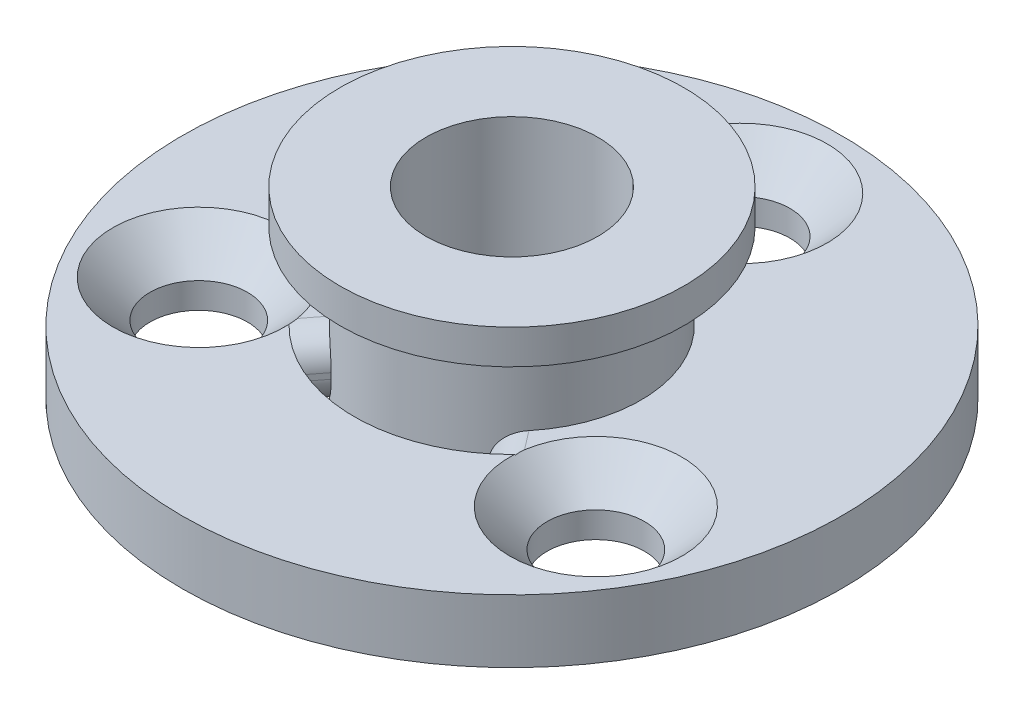
ISO-10303-21;
HEADER;
FILE_DESCRIPTION(('STEP AP214'),'2;1');
FILE_NAME('part.step','',(''),(''),'','','');
FILE_SCHEMA(('AUTOMOTIVE_DESIGN { 1 0 10303 214 1 1 1 1 }'));
ENDSEC;
DATA;
#1=APPLICATION_CONTEXT('core data for automotive mechanical design processes');
#2=APPLICATION_PROTOCOL_DEFINITION('international standard','automotive_design',2000,#1);
#3=PRODUCT_CONTEXT('',#1,'mechanical');
#4=PRODUCT('Part','Part','',(#3));
#5=PRODUCT_RELATED_PRODUCT_CATEGORY('part','',(#4));
#6=PRODUCT_DEFINITION_FORMATION('','',#4);
#7=PRODUCT_DEFINITION_CONTEXT('part definition',#1,'design');
#8=PRODUCT_DEFINITION('design','',#6,#7);
#9=PRODUCT_DEFINITION_SHAPE('','',#8);
#10=(LENGTH_UNIT() NAMED_UNIT(*) SI_UNIT(.MILLI.,.METRE.));
#11=(NAMED_UNIT(*) PLANE_ANGLE_UNIT() SI_UNIT($,.RADIAN.));
#12=(NAMED_UNIT(*) SI_UNIT($,.STERADIAN.) SOLID_ANGLE_UNIT());
#13=UNCERTAINTY_MEASURE_WITH_UNIT(LENGTH_MEASURE(1.E-05),#10,'distance_accuracy_value','');
#14=(GEOMETRIC_REPRESENTATION_CONTEXT(3) GLOBAL_UNCERTAINTY_ASSIGNED_CONTEXT((#13)) GLOBAL_UNIT_ASSIGNED_CONTEXT((#10,
#11,#12)) REPRESENTATION_CONTEXT('',''));
#15=CARTESIAN_POINT('',(0.,0.,0.));
#16=DIRECTION('',(0.,0.,1.));
#17=DIRECTION('',(1.,0.,0.));
#18=AXIS2_PLACEMENT_3D('',#15,#16,#17);
#19=CARTESIAN_POINT('',(11.5,-3.2,0.));
#20=DIRECTION('',(0.,1.,0.));
#21=DIRECTION('',(0.,0.,1.));
#22=AXIS2_PLACEMENT_3D('',#19,#20,#21);
#23=PLANE('',#22);
#24=DIRECTION('',(-0.608761429008723,0.,-0.793353340291233));
#25=VECTOR('',#24,1.);
#26=CARTESIAN_POINT('',(5.05514383095177,-3.2,4.94531207215343));
#27=LINE('',#26,#25);
#28=CARTESIAN_POINT('',(4.08573416051475,-3.2,3.68195279296229));
#29=VERTEX_POINT('',#28);
#30=CARTESIAN_POINT('',(3.46428327027597,-3.2,2.87206222482836));
#31=VERTEX_POINT('',#30);
#32=EDGE_CURVE('E130',#29,#31,#27,.T.);
#33=ORIENTED_EDGE('',*,*,#32,.T.);
#34=CARTESIAN_POINT('',(0.,-3.2,0.));
#35=DIRECTION('',(0.,-1.,0.));
#36=DIRECTION('',(0.,0.,-1.));
#37=AXIS2_PLACEMENT_3D('',#34,#35,#36);
#38=CIRCLE('',#37,4.5);
#39=CARTESIAN_POINT('',(-3.46428327027597,-3.2,2.87206222482836));
#40=VERTEX_POINT('',#39);
#41=EDGE_CURVE('E124',#31,#40,#38,.T.);
#42=ORIENTED_EDGE('',*,*,#41,.T.);
#43=DIRECTION('',(-0.608761429008722,0.,0.793353340291234));
#44=VECTOR('',#43,1.);
#45=CARTESIAN_POINT('',(3.46843715036929,-3.2,-6.16283493017087));
#46=LINE('',#45,#44);
#47=CARTESIAN_POINT('',(-4.08573416051475,-3.2,3.68195279296229));
#48=VERTEX_POINT('',#47);
#49=EDGE_CURVE('E128',#40,#48,#46,.T.);
#50=ORIENTED_EDGE('',*,*,#49,.T.);
#51=CARTESIAN_POINT('',(0.,-3.2,0.));
#52=DIRECTION('',(0.,1.,0.));
#53=DIRECTION('',(0.,0.,1.));
#54=AXIS2_PLACEMENT_3D('',#51,#52,#53);
#55=CIRCLE('',#54,5.5);
#56=EDGE_CURVE('E133',#48,#29,#55,.T.);
#57=ORIENTED_EDGE('',*,*,#56,.T.);
#58=EDGE_LOOP('',(#33,#42,#50,#57));
#59=FACE_BOUND('',#58,.T.);
#60=CARTESIAN_POINT('',(-6.92820323027555,-3.2,3.99999999999994));
#61=DIRECTION('',(0.,1.,0.));
#62=DIRECTION('',(0.,0.,1.));
#63=AXIS2_PLACEMENT_3D('',#60,#61,#62);
#64=CIRCLE('',#63,1.7);
#65=CARTESIAN_POINT('',(-6.92820323027555,-3.2,5.69999999999994));
#66=VERTEX_POINT('',#65);
#67=EDGE_CURVE('E335',#66,#66,#64,.T.);
#68=ORIENTED_EDGE('',*,*,#67,.T.);
#69=EDGE_LOOP('',(#68));
#70=FACE_BOUND('',#69,.T.);
#71=CARTESIAN_POINT('',(6.92820323027549,-3.2,4.00000000000003));
#72=DIRECTION('',(0.,1.,0.));
#73=DIRECTION('',(0.,0.,1.));
#74=AXIS2_PLACEMENT_3D('',#71,#72,#73);
#75=CIRCLE('',#74,1.7);
#76=CARTESIAN_POINT('',(6.92820323027549,-3.2,5.70000000000003));
#77=VERTEX_POINT('',#76);
#78=EDGE_CURVE('E326',#77,#77,#75,.T.);
#79=ORIENTED_EDGE('',*,*,#78,.T.);
#80=EDGE_LOOP('',(#79));
#81=FACE_BOUND('',#80,.T.);
#82=CARTESIAN_POINT('',(0.,-3.2,-8.));
#83=DIRECTION('',(0.,1.,0.));
#84=DIRECTION('',(0.,0.,1.));
#85=AXIS2_PLACEMENT_3D('',#82,#83,#84);
#86=CIRCLE('',#85,1.7);
#87=CARTESIAN_POINT('',(0.,-3.2,-6.3));
#88=VERTEX_POINT('',#87);
#89=EDGE_CURVE('E317',#88,#88,#86,.T.);
#90=ORIENTED_EDGE('',*,*,#89,.T.);
#91=EDGE_LOOP('',(#90));
#92=FACE_BOUND('',#91,.T.);
#93=CARTESIAN_POINT('',(0.,-3.2,0.));
#94=DIRECTION('',(0.,1.,0.));
#95=DIRECTION('',(0.,0.,1.));
#96=AXIS2_PLACEMENT_3D('',#93,#94,#95);
#97=CIRCLE('',#96,11.5);
#98=CARTESIAN_POINT('',(0.,-3.2,11.5));
#99=VERTEX_POINT('',#98);
#100=EDGE_CURVE('E314',#99,#99,#97,.T.);
#101=ORIENTED_EDGE('',*,*,#100,.F.);
#102=EDGE_LOOP('',(#101));
#103=FACE_BOUND('',#102,.T.);
#104=CARTESIAN_POINT('',(0.,-3.2,0.));
#105=DIRECTION('',(0.,1.,0.));
#106=DIRECTION('',(0.,0.,1.));
#107=AXIS2_PLACEMENT_3D('',#104,#105,#106);
#108=CIRCLE('',#107,3.);
#109=CARTESIAN_POINT('',(0.,-3.2,3.));
#110=VERTEX_POINT('',#109);
#111=EDGE_CURVE('E149',#110,#110,#108,.T.);
#112=ORIENTED_EDGE('',*,*,#111,.T.);
#113=EDGE_LOOP('',(#112));
#114=FACE_BOUND('',#113,.T.);
#115=ADVANCED_FACE('F41',(#59,#70,#81,#92,#103,#114),#23,.F.);
#116=CARTESIAN_POINT('',(0.,4.68987341772152,0.));
#117=DIRECTION('',(0.,1.,0.));
#118=DIRECTION('',(0.,0.,1.));
#119=AXIS2_PLACEMENT_3D('',#116,#117,#118);
#120=CYLINDRICAL_SURFACE('',#119,3.);
#121=ORIENTED_EDGE('',*,*,#111,.F.);
#122=EDGE_LOOP('',(#121));
#123=FACE_BOUND('',#122,.T.);
#124=CARTESIAN_POINT('',(0.,3.2,0.));
#125=DIRECTION('',(0.,1.,0.));
#126=DIRECTION('',(0.,0.,1.));
#127=AXIS2_PLACEMENT_3D('',#124,#125,#126);
#128=CIRCLE('',#127,3.);
#129=CARTESIAN_POINT('',(0.,3.2,3.));
#130=VERTEX_POINT('',#129);
#131=EDGE_CURVE('E154',#130,#130,#128,.T.);
#132=ORIENTED_EDGE('',*,*,#131,.T.);
#133=EDGE_LOOP('',(#132));
#134=FACE_BOUND('',#133,.T.);
#135=ADVANCED_FACE('F269',(#123,#134),#120,.F.);
#136=CARTESIAN_POINT('',(3.,3.2,0.));
#137=DIRECTION('',(0.,-1.,0.));
#138=DIRECTION('',(0.,0.,-1.));
#139=AXIS2_PLACEMENT_3D('',#136,#137,#138);
#140=PLANE('',#139);
#141=ORIENTED_EDGE('',*,*,#131,.F.);
#142=EDGE_LOOP('',(#141));
#143=FACE_BOUND('',#142,.T.);
#144=CARTESIAN_POINT('',(0.,3.2,0.));
#145=DIRECTION('',(0.,1.,0.));
#146=DIRECTION('',(0.,0.,1.));
#147=AXIS2_PLACEMENT_3D('',#144,#145,#146);
#148=CIRCLE('',#147,6.);
#149=CARTESIAN_POINT('',(0.,3.2,6.));
#150=VERTEX_POINT('',#149);
#151=EDGE_CURVE('E298',#150,#150,#148,.T.);
#152=ORIENTED_EDGE('',*,*,#151,.T.);
#153=EDGE_LOOP('',(#152));
#154=FACE_BOUND('',#153,.T.);
#155=ADVANCED_FACE('F272',(#143,#154),#140,.F.);
#156=CARTESIAN_POINT('',(0.,4.68987341772152,0.));
#157=DIRECTION('',(0.,1.,0.));
#158=DIRECTION('',(0.,0.,1.));
#159=AXIS2_PLACEMENT_3D('',#156,#157,#158);
#160=CYLINDRICAL_SURFACE('',#159,6.);
#161=ORIENTED_EDGE('',*,*,#151,.F.);
#162=EDGE_LOOP('',(#161));
#163=FACE_BOUND('',#162,.T.);
#164=CARTESIAN_POINT('',(0.,2.,0.));
#165=DIRECTION('',(0.,1.,0.));
#166=DIRECTION('',(0.,0.,1.));
#167=AXIS2_PLACEMENT_3D('',#164,#165,#166);
#168=CIRCLE('',#167,6.);
#169=CARTESIAN_POINT('',(0.,2.,6.));
#170=VERTEX_POINT('',#169);
#171=EDGE_CURVE('E292',#170,#170,#168,.T.);
#172=ORIENTED_EDGE('',*,*,#171,.T.);
#173=EDGE_LOOP('',(#172));
#174=FACE_BOUND('',#173,.T.);
#175=ADVANCED_FACE('F276',(#163,#174),#160,.T.);
#176=CARTESIAN_POINT('',(6.,2.,0.));
#177=DIRECTION('',(0.,1.,0.));
#178=DIRECTION('',(0.,0.,1.));
#179=AXIS2_PLACEMENT_3D('',#176,#177,#178);
#180=PLANE('',#179);
#181=ORIENTED_EDGE('',*,*,#171,.F.);
#182=EDGE_LOOP('',(#181));
#183=FACE_BOUND('',#182,.T.);
#184=CARTESIAN_POINT('',(0.,2.,0.));
#185=DIRECTION('',(0.,1.,0.));
#186=DIRECTION('',(0.,0.,1.));
#187=AXIS2_PLACEMENT_3D('',#184,#185,#186);
#188=CIRCLE('',#187,4.5);
#189=CARTESIAN_POINT('',(0.,2.,4.5));
#190=VERTEX_POINT('',#189);
#191=EDGE_CURVE('E295',#190,#190,#188,.T.);
#192=ORIENTED_EDGE('',*,*,#191,.T.);
#193=EDGE_LOOP('',(#192));
#194=FACE_BOUND('',#193,.T.);
#195=ADVANCED_FACE('F279',(#183,#194),#180,.F.);
#196=CARTESIAN_POINT('',(0.,4.68987341772152,0.));
#197=DIRECTION('',(0.,1.,0.));
#198=DIRECTION('',(0.,0.,1.));
#199=AXIS2_PLACEMENT_3D('',#196,#197,#198);
#200=CYLINDRICAL_SURFACE('',#199,4.5);
#201=ORIENTED_EDGE('',*,*,#191,.F.);
#202=EDGE_LOOP('',(#201));
#203=FACE_BOUND('',#202,.T.);
#204=DIRECTION('',(0.,1.,0.));
#205=VECTOR('',#204,1.);
#206=CARTESIAN_POINT('',(2.73942643053925,-3.2,3.57009003131055));
#207=LINE('',#206,#205);
#208=CARTESIAN_POINT('',(2.73942643053925,-2.2,3.57009003131055));
#209=VERTEX_POINT('',#208);
#210=CARTESIAN_POINT('',(2.73942643053925,-2.,3.57009003131055));
#211=VERTEX_POINT('',#210);
#212=EDGE_CURVE('E344',#209,#211,#207,.T.);
#213=ORIENTED_EDGE('',*,*,#212,.T.);
#214=CARTESIAN_POINT('',(2.73942643053925,-2.,3.57009003131055));
#215=CARTESIAN_POINT('',(2.73942565688171,-1.97187899760377,3.57008871283491));
#216=CARTESIAN_POINT('',(2.74036818941399,-1.94377146341499,3.56936760936641));
#217=CARTESIAN_POINT('',(2.74412233525025,-1.88775727596897,3.5664829836844));
#218=CARTESIAN_POINT('',(2.74693386278592,-1.85985061355311,3.56431952766053));
#219=CARTESIAN_POINT('',(2.75813408967678,-1.77677561027794,3.5556702819096));
#220=CARTESIAN_POINT('',(2.76928854928323,-1.72216326337328,3.54702562133556));
#221=CARTESIAN_POINT('',(2.79850826333545,-1.61608219502955,3.5240166391249));
#222=CARTESIAN_POINT('',(2.81657702190278,-1.5646150829377,3.5096494171804));
#223=CARTESIAN_POINT('',(2.85886409197046,-1.46629203883097,3.47528924854408));
#224=CARTESIAN_POINT('',(2.88308136316857,-1.41943532861472,3.45529725347816));
#225=CARTESIAN_POINT('',(2.93660586520829,-1.33176854362263,3.40992237773051));
#226=CARTESIAN_POINT('',(2.9659024654471,-1.2909461636677,3.38455073195109));
#227=CARTESIAN_POINT('',(3.02842641542243,-1.21640101617028,3.32872129203923));
#228=CARTESIAN_POINT('',(3.06165372700131,-1.18267817971731,3.29826354727928));
#229=CARTESIAN_POINT('',(3.13041466986281,-1.12353436985234,3.23306780000334));
#230=CARTESIAN_POINT('',(3.16592652704929,-1.09804588777396,3.19836799524316));
#231=CARTESIAN_POINT('',(3.23816827731865,-1.0556362673716,3.12520455131174));
#232=CARTESIAN_POINT('',(3.27489786586538,-1.0387130039815,3.08674184855976));
#233=CARTESIAN_POINT('',(3.33734606601656,-1.01747424844011,3.01886932886236));
#234=CARTESIAN_POINT('',(3.3630933518554,-1.01090662968128,2.99016573835663));
#235=CARTESIAN_POINT('',(3.41412007456745,-1.00216907636313,2.93177466333198));
#236=CARTESIAN_POINT('',(3.4394001995666,-0.999992060034545,2.90208884184056));
#237=CARTESIAN_POINT('',(3.46428327027597,-1.,2.87206222482836));
#238=B_SPLINE_CURVE_WITH_KNOTS('',3,(#214,#215,#216,#217,#218,#219,#220,#221,#222,#223,#224,
#225,#226,#227,#228,#229,#230,#231,#232,#233,#234,#235,#236,#237),.UNSPECIFIED.,.F.,.F.,(4,2,2,
2,2,2,2,2,2,2,2,4),(0.,0.0843112207709436,0.168618572761153,0.336969701442703,0.505406262614099,
0.67381434400424,0.841874125095973,1.00993227486941,1.17657542266951,1.34317720532399,
1.46027197682244,1.57717773018718),.UNSPECIFIED.);
#239=CARTESIAN_POINT('',(3.46428327027597,-1.,2.87206222482836));
#240=VERTEX_POINT('',#239);
#241=EDGE_CURVE('E55',#211,#240,#238,.T.);
#242=ORIENTED_EDGE('',*,*,#241,.T.);
#243=CARTESIAN_POINT('',(0.,-1.,0.));
#244=DIRECTION('',(0.,1.,0.));
#245=DIRECTION('',(0.,0.,1.));
#246=AXIS2_PLACEMENT_3D('',#243,#244,#245);
#247=CIRCLE('',#246,4.5);
#248=CARTESIAN_POINT('',(-3.46428327027597,-1.,2.87206222482836));
#249=VERTEX_POINT('',#248);
#250=EDGE_CURVE('E296',#240,#249,#247,.T.);
#251=ORIENTED_EDGE('',*,*,#250,.T.);
#252=CARTESIAN_POINT('',(-3.46428327027597,-1.,2.87206222482836));
#253=CARTESIAN_POINT('',(-3.44636968878849,-1.00000017399588,2.89367168476496));
#254=CARTESIAN_POINT('',(-3.42825891884711,-1.00112427543845,2.91510280001001));
#255=CARTESIAN_POINT('',(-3.39176055755314,-1.0056375964909,2.957488990778));
#256=CARTESIAN_POINT('',(-3.37337293644022,-1.00902706134166,2.97844401450683));
#257=CARTESIAN_POINT('',(-3.31802561133945,-1.02260712910446,3.04035460548356));
#258=CARTESIAN_POINT('',(-3.2808337210137,-1.03620932342427,3.08041314242673));
#259=CARTESIAN_POINT('',(-3.20714190665605,-1.07232170191356,3.15706810237797));
#260=CARTESIAN_POINT('',(-3.17064290481398,-1.0948429898635,3.19366013914767));
#261=CARTESIAN_POINT('',(-3.09975162123149,-1.14823595223073,3.26251152187056));
#262=CARTESIAN_POINT('',(-3.0653584384749,-1.17910402425493,3.29477272800139));
#263=CARTESIAN_POINT('',(-3.00044721273947,-1.24789626889389,3.35398670438884));
#264=CARTESIAN_POINT('',(-2.96988545782309,-1.28572573291121,3.3810017555841));
#265=CARTESIAN_POINT('',(-2.91333245926661,-1.36764844571653,3.42985332602239));
#266=CARTESIAN_POINT('',(-2.88734254710892,-1.41174351253291,3.45168833729783));
#267=CARTESIAN_POINT('',(-2.84086507050541,-1.50520101693256,3.49004325894955));
#268=CARTESIAN_POINT('',(-2.82040794046862,-1.55459058256651,3.50653386575627));
#269=CARTESIAN_POINT('',(-2.78602900318347,-1.65704784234158,3.53391106299234));
#270=CARTESIAN_POINT('',(-2.77210415590609,-1.7101138123148,3.54480026046408));
#271=CARTESIAN_POINT('',(-2.7543443677954,-1.80282992091665,3.55860594428166));
#272=CARTESIAN_POINT('',(-2.7487598387046,-1.84195320632167,3.56291429137886));
#273=CARTESIAN_POINT('',(-2.74129778874026,-1.92071258105357,3.56865406960451));
#274=CARTESIAN_POINT('',(-2.7394158389709,-1.96034800056224,3.57008893792455));
#275=CARTESIAN_POINT('',(-2.73942643053925,-2.,3.57009003131055));
#276=B_SPLINE_CURVE_WITH_KNOTS('',3,(#252,#253,#254,#255,#256,#257,#258,#259,#260,#261,#262,
#263,#264,#265,#266,#267,#268,#269,#270,#271,#272,#273,#274,#275),.UNSPECIFIED.,.F.,.F.,(4,2,2,
2,2,2,2,2,2,2,2,4),(0.,0.0841591112206655,0.168327334709592,0.336442524073814,0.504767668859961,
0.673020281739215,0.839133566949739,1.00529515041985,1.17235296817529,1.33933296234293,
1.45832896752482,1.5771825470993),.UNSPECIFIED.);
#277=CARTESIAN_POINT('',(-2.73942643053925,-2.,3.57009003131055));
#278=VERTEX_POINT('',#277);
#279=EDGE_CURVE('E203',#249,#278,#276,.T.);
#280=ORIENTED_EDGE('',*,*,#279,.T.);
#281=DIRECTION('',(0.,1.,0.));
#282=VECTOR('',#281,1.);
#283=CARTESIAN_POINT('',(-2.73942643053925,-3.2,3.57009003131055));
#284=LINE('',#283,#282);
#285=CARTESIAN_POINT('',(-2.73942643053925,-2.2,3.57009003131055));
#286=VERTEX_POINT('',#285);
#287=EDGE_CURVE('E141',#286,#278,#284,.T.);
#288=ORIENTED_EDGE('',*,*,#287,.F.);
#289=CARTESIAN_POINT('',(-2.73942643053925,-2.2,3.57009003131055));
#290=CARTESIAN_POINT('',(-2.73942565688171,-2.22812100239623,3.57008871283491));
#291=CARTESIAN_POINT('',(-2.74036818941399,-2.25622853658501,3.56936760936641));
#292=CARTESIAN_POINT('',(-2.74412233525025,-2.31224272403103,3.5664829836844));
#293=CARTESIAN_POINT('',(-2.74693386278592,-2.34014938644689,3.56431952766053));
#294=CARTESIAN_POINT('',(-2.75813408967678,-2.42322438972206,3.55567028190961));
#295=CARTESIAN_POINT('',(-2.76928854928323,-2.47783673662672,3.54702562133556));
#296=CARTESIAN_POINT('',(-2.79850826333545,-2.58391780497045,3.5240166391249));
#297=CARTESIAN_POINT('',(-2.81657702190278,-2.6353849170623,3.5096494171804));
#298=CARTESIAN_POINT('',(-2.85886409197046,-2.73370796116903,3.47528924854408));
#299=CARTESIAN_POINT('',(-2.88308136316857,-2.78056467138528,3.45529725347816));
#300=CARTESIAN_POINT('',(-2.93660586520829,-2.86823145637737,3.40992237773051));
#301=CARTESIAN_POINT('',(-2.96590246544709,-2.9090538363323,3.38455073195109));
#302=CARTESIAN_POINT('',(-3.02842641542243,-2.98359898382972,3.32872129203923));
#303=CARTESIAN_POINT('',(-3.06165372700131,-3.01732182028269,3.29826354727928));
#304=CARTESIAN_POINT('',(-3.13041466986281,-3.07646563014766,3.23306780000334));
#305=CARTESIAN_POINT('',(-3.16592652704929,-3.10195411222604,3.19836799524316));
#306=CARTESIAN_POINT('',(-3.23816827731865,-3.1443637326284,3.12520455131174));
#307=CARTESIAN_POINT('',(-3.27489786586537,-3.1612869960185,3.08674184855976));
#308=CARTESIAN_POINT('',(-3.33734606601656,-3.18252575155989,3.01886932886236));
#309=CARTESIAN_POINT('',(-3.36309335185539,-3.18909337031872,2.99016573835663));
#310=CARTESIAN_POINT('',(-3.41412007456745,-3.19783092363687,2.93177466333199));
#311=CARTESIAN_POINT('',(-3.4394001995666,-3.20000793996546,2.90208884184057));
#312=CARTESIAN_POINT('',(-3.46428327027597,-3.2,2.87206222482836));
#313=B_SPLINE_CURVE_WITH_KNOTS('',3,(#289,#290,#291,#292,#293,#294,#295,#296,#297,#298,#299,
#300,#301,#302,#303,#304,#305,#306,#307,#308,#309,#310,#311,#312),.UNSPECIFIED.,.F.,.F.,(4,2,2,
2,2,2,2,2,2,2,2,4),(0.,0.0843112207709435,0.168618572761153,0.336969701442703,0.505406262614099,
0.673814344004239,0.841874125095972,1.00993227486941,1.17657542266951,1.34317720532399,
1.46027197682244,1.57717773018718),.UNSPECIFIED.);
#314=EDGE_CURVE('E137',#286,#40,#313,.T.);
#315=ORIENTED_EDGE('',*,*,#314,.T.);
#316=ORIENTED_EDGE('',*,*,#41,.F.);
#317=CARTESIAN_POINT('',(3.46428327027597,-3.2,2.87206222482836));
#318=CARTESIAN_POINT('',(3.4463696887885,-3.19999982600412,2.89367168476496));
#319=CARTESIAN_POINT('',(3.42825891884712,-3.19887572456155,2.91510280001001));
#320=CARTESIAN_POINT('',(3.39176055755314,-3.1943624035091,2.957488990778));
#321=CARTESIAN_POINT('',(3.37337293644022,-3.19097293865834,2.97844401450682));
#322=CARTESIAN_POINT('',(3.31802561133945,-3.17739287089554,3.04035460548355));
#323=CARTESIAN_POINT('',(3.2808337210137,-3.16379067657573,3.08041314242673));
#324=CARTESIAN_POINT('',(3.20714190665606,-3.12767829808644,3.15706810237797));
#325=CARTESIAN_POINT('',(3.17064290481398,-3.1051570101365,3.19366013914767));
#326=CARTESIAN_POINT('',(3.09975162123149,-3.05176404776927,3.26251152187056));
#327=CARTESIAN_POINT('',(3.0653584384749,-3.02089597574507,3.29477272800138));
#328=CARTESIAN_POINT('',(3.00044721273947,-2.95210373110611,3.35398670438884));
#329=CARTESIAN_POINT('',(2.9698854578231,-2.91427426708879,3.38100175558409));
#330=CARTESIAN_POINT('',(2.91333245926661,-2.83235155428347,3.42985332602238));
#331=CARTESIAN_POINT('',(2.88734254710892,-2.78825648746709,3.45168833729782));
#332=CARTESIAN_POINT('',(2.84086507050542,-2.69479898306744,3.49004325894955));
#333=CARTESIAN_POINT('',(2.82040794046862,-2.64540941743349,3.50653386575627));
#334=CARTESIAN_POINT('',(2.78602900318347,-2.54295215765843,3.53391106299234));
#335=CARTESIAN_POINT('',(2.77210415590609,-2.4898861876852,3.54480026046408));
#336=CARTESIAN_POINT('',(2.7543443677954,-2.39717007908335,3.55860594428166));
#337=CARTESIAN_POINT('',(2.7487598387046,-2.35804679367834,3.56291429137885));
#338=CARTESIAN_POINT('',(2.74129778874026,-2.27928741894643,3.56865406960451));
#339=CARTESIAN_POINT('',(2.7394158389709,-2.23965199943776,3.57008893792455));
#340=CARTESIAN_POINT('',(2.73942643053925,-2.2,3.57009003131055));
#341=B_SPLINE_CURVE_WITH_KNOTS('',3,(#317,#318,#319,#320,#321,#322,#323,#324,#325,#326,#327,
#328,#329,#330,#331,#332,#333,#334,#335,#336,#337,#338,#339,#340),.UNSPECIFIED.,.F.,.F.,(4,2,2,
2,2,2,2,2,2,2,2,4),(0.,0.0841591112206649,0.168327334709591,0.336442524073814,0.50476766885996,
0.673020281739215,0.839133566949739,1.00529515041985,1.17235296817528,1.33933296234293,
1.45832896752482,1.5771825470993),.UNSPECIFIED.);
#342=EDGE_CURVE('E245',#31,#209,#341,.T.);
#343=ORIENTED_EDGE('',*,*,#342,.T.);
#344=EDGE_LOOP('',(#213,#242,#251,#280,#288,#315,#316,#343));
#345=FACE_BOUND('',#344,.T.);
#346=ADVANCED_FACE('F139',(#203,#345),#200,.T.);
#347=CARTESIAN_POINT('',(4.5,-1.,0.));
#348=DIRECTION('',(0.,-1.,0.));
#349=DIRECTION('',(0.,0.,-1.));
#350=AXIS2_PLACEMENT_3D('',#347,#348,#349);
#351=PLANE('',#350);
#352=CARTESIAN_POINT('',(0.,-1.,0.));
#353=DIRECTION('',(0.,1.,0.));
#354=DIRECTION('',(0.,0.,1.));
#355=AXIS2_PLACEMENT_3D('',#352,#353,#354);
#356=CIRCLE('',#355,5.5);
#357=CARTESIAN_POINT('',(-3.93218384465516,-1.,3.84550779635577));
#358=VERTEX_POINT('',#357);
#359=CARTESIAN_POINT('',(3.93218384465511,-1.,3.84550779635582));
#360=VERTEX_POINT('',#359);
#361=EDGE_CURVE('E62',#358,#360,#356,.T.);
#362=ORIENTED_EDGE('',*,*,#361,.F.);
#363=CARTESIAN_POINT('',(-6.92820323027555,-1.,3.99999999999994));
#364=DIRECTION('',(0.,1.,0.));
#365=DIRECTION('',(0.,0.,1.));
#366=AXIS2_PLACEMENT_3D('',#363,#364,#365);
#367=CIRCLE('',#366,3.);
#368=CARTESIAN_POINT('',(-3.96591721349357,-1.,3.52580430750792));
#369=VERTEX_POINT('',#368);
#370=EDGE_CURVE('E341',#369,#358,#367,.T.);
#371=ORIENTED_EDGE('',*,*,#370,.F.);
#372=DIRECTION('',(-0.608761429008722,0.,0.793353340291234));
#373=VECTOR('',#372,1.);
#374=CARTESIAN_POINT('',(0.874303808228103,-1.,-2.78209453815913));
#375=LINE('',#374,#373);
#376=EDGE_CURVE('E169',#369,#249,#375,.F.);
#377=ORIENTED_EDGE('',*,*,#376,.T.);
#378=ORIENTED_EDGE('',*,*,#250,.F.);
#379=DIRECTION('',(-0.608761429008723,0.,-0.793353340291233));
#380=VECTOR('',#379,1.);
#381=CARTESIAN_POINT('',(2.46101048881057,-1.,1.56457168014169));
#382=LINE('',#381,#380);
#383=CARTESIAN_POINT('',(3.96591721349354,-1.,3.52580430750787));
#384=VERTEX_POINT('',#383);
#385=EDGE_CURVE('E167',#240,#384,#382,.F.);
#386=ORIENTED_EDGE('',*,*,#385,.T.);
#387=CARTESIAN_POINT('',(6.92820323027549,-1.,4.00000000000003));
#388=DIRECTION('',(0.,1.,0.));
#389=DIRECTION('',(0.,0.,1.));
#390=AXIS2_PLACEMENT_3D('',#387,#388,#389);
#391=CIRCLE('',#390,3.);
#392=EDGE_CURVE('E332',#360,#384,#391,.T.);
#393=ORIENTED_EDGE('',*,*,#392,.F.);
#394=EDGE_LOOP('',(#362,#371,#377,#378,#386,#393));
#395=FACE_BOUND('',#394,.T.);
#396=CARTESIAN_POINT('',(0.,-1.,-8.));
#397=DIRECTION('',(0.,1.,0.));
#398=DIRECTION('',(0.,0.,1.));
#399=AXIS2_PLACEMENT_3D('',#396,#397,#398);
#400=CIRCLE('',#399,3.);
#401=CARTESIAN_POINT('',(0.,-1.,-5.));
#402=VERTEX_POINT('',#401);
#403=EDGE_CURVE('E323',#402,#402,#400,.T.);
#404=ORIENTED_EDGE('',*,*,#403,.F.);
#405=EDGE_LOOP('',(#404));
#406=FACE_BOUND('',#405,.T.);
#407=CARTESIAN_POINT('',(0.,-1.,0.));
#408=DIRECTION('',(0.,1.,0.));
#409=DIRECTION('',(0.,0.,1.));
#410=AXIS2_PLACEMENT_3D('',#407,#408,#409);
#411=CIRCLE('',#410,11.5);
#412=CARTESIAN_POINT('',(0.,-1.,11.5));
#413=VERTEX_POINT('',#412);
#414=EDGE_CURVE('E301',#413,#413,#411,.T.);
#415=ORIENTED_EDGE('',*,*,#414,.T.);
#416=EDGE_LOOP('',(#415));
#417=FACE_BOUND('',#416,.T.);
#418=ADVANCED_FACE('F287',(#395,#406,#417),#351,.F.);
#419=CARTESIAN_POINT('',(0.,4.68987341772152,0.));
#420=DIRECTION('',(0.,1.,0.));
#421=DIRECTION('',(0.,0.,1.));
#422=AXIS2_PLACEMENT_3D('',#419,#420,#421);
#423=CYLINDRICAL_SURFACE('',#422,11.5);
#424=ORIENTED_EDGE('',*,*,#414,.F.);
#425=EDGE_LOOP('',(#424));
#426=FACE_BOUND('',#425,.T.);
#427=ORIENTED_EDGE('',*,*,#100,.T.);
#428=EDGE_LOOP('',(#427));
#429=FACE_BOUND('',#428,.T.);
#430=ADVANCED_FACE('F404',(#426,#429),#423,.T.);
#431=CARTESIAN_POINT('',(0.,-1.,-8.));
#432=DIRECTION('',(0.,1.,0.));
#433=DIRECTION('',(0.,0.,1.));
#434=AXIS2_PLACEMENT_3D('',#431,#432,#433);
#435=CYLINDRICAL_SURFACE('',#434,1.7);
#436=ORIENTED_EDGE('',*,*,#89,.F.);
#437=EDGE_LOOP('',(#436));
#438=FACE_BOUND('',#437,.T.);
#439=CARTESIAN_POINT('',(0.,-2.3,-8.));
#440=DIRECTION('',(0.,1.,0.));
#441=DIRECTION('',(0.,0.,1.));
#442=AXIS2_PLACEMENT_3D('',#439,#440,#441);
#443=CIRCLE('',#442,1.7);
#444=CARTESIAN_POINT('',(0.,-2.3,-6.3));
#445=VERTEX_POINT('',#444);
#446=EDGE_CURVE('E320',#445,#445,#443,.T.);
#447=ORIENTED_EDGE('',*,*,#446,.T.);
#448=EDGE_LOOP('',(#447));
#449=FACE_BOUND('',#448,.T.);
#450=ADVANCED_FACE('F400',(#438,#449),#435,.F.);
#451=CARTESIAN_POINT('',(0.,-1.,-8.));
#452=DIRECTION('',(0.,1.,0.));
#453=DIRECTION('',(0.,0.,1.));
#454=AXIS2_PLACEMENT_3D('',#451,#452,#453);
#455=CONICAL_SURFACE('',#454,3.,0.785398163397448);
#456=ORIENTED_EDGE('',*,*,#446,.F.);
#457=EDGE_LOOP('',(#456));
#458=FACE_BOUND('',#457,.T.);
#459=ORIENTED_EDGE('',*,*,#403,.T.);
#460=EDGE_LOOP('',(#459));
#461=FACE_BOUND('',#460,.T.);
#462=ADVANCED_FACE('F396',(#458,#461),#455,.F.);
#463=CARTESIAN_POINT('',(6.92820323027549,-1.,4.00000000000003));
#464=DIRECTION('',(0.,1.,0.));
#465=DIRECTION('',(0.,0.,1.));
#466=AXIS2_PLACEMENT_3D('',#463,#464,#465);
#467=CYLINDRICAL_SURFACE('',#466,1.7);
#468=ORIENTED_EDGE('',*,*,#78,.F.);
#469=EDGE_LOOP('',(#468));
#470=FACE_BOUND('',#469,.T.);
#471=CARTESIAN_POINT('',(6.92820323027549,-2.3,4.00000000000003));
#472=DIRECTION('',(0.,1.,0.));
#473=DIRECTION('',(0.,0.,1.));
#474=AXIS2_PLACEMENT_3D('',#471,#472,#473);
#475=CIRCLE('',#474,1.7);
#476=CARTESIAN_POINT('',(6.92820323027549,-2.3,5.70000000000003));
#477=VERTEX_POINT('',#476);
#478=EDGE_CURVE('E329',#477,#477,#475,.T.);
#479=ORIENTED_EDGE('',*,*,#478,.T.);
#480=EDGE_LOOP('',(#479));
#481=FACE_BOUND('',#480,.T.);
#482=ADVANCED_FACE('F389',(#470,#481),#467,.F.);
#483=CARTESIAN_POINT('',(6.92820323027549,-1.,4.00000000000003));
#484=DIRECTION('',(0.,1.,0.));
#485=DIRECTION('',(0.,0.,1.));
#486=AXIS2_PLACEMENT_3D('',#483,#484,#485);
#487=CONICAL_SURFACE('',#486,3.,0.785398163397448);
#488=ORIENTED_EDGE('',*,*,#478,.F.);
#489=EDGE_LOOP('',(#488));
#490=FACE_BOUND('',#489,.T.);
#491=ORIENTED_EDGE('',*,*,#392,.T.);
#492=CARTESIAN_POINT('',(3.96591721349354,-1.,3.52580430750787));
#493=CARTESIAN_POINT('',(3.95915642311976,-1.00003435730503,3.56822919738323));
#494=CARTESIAN_POINT('',(3.95470296847834,-1.00145744575782,3.61091285811898));
#495=CARTESIAN_POINT('',(3.94977528648748,-1.00640555639917,3.69608161476047));
#496=CARTESIAN_POINT('',(3.94927151585503,-1.00991476139556,3.73856580463089));
#497=CARTESIAN_POINT('',(3.95152546823736,-1.01837696081481,3.82323844739504));
#498=CARTESIAN_POINT('',(3.95428102375421,-1.02332899408668,3.86542707808025));
#499=CARTESIAN_POINT('',(3.96263034651228,-1.03429991373643,3.94971532970901));
#500=CARTESIAN_POINT('',(3.96824530586028,-1.04032654443614,3.99181189432978));
#501=CARTESIAN_POINT('',(3.97505430591007,-1.04665956517196,4.03363264053968));
#502=B_SPLINE_CURVE_WITH_KNOTS('',3,(#492,#493,#494,#495,#496,#497,#498,#499,#500,#501),
.UNSPECIFIED.,.F.,.F.,(4,2,2,2,4),(0.,0.128643883751569,0.256324596034011,0.383920446555394,
0.512476026932304),.UNSPECIFIED.);
#503=CARTESIAN_POINT('',(3.95215523097799,-1.01880999759691,3.82497961174345));
#504=VERTEX_POINT('',#503);
#505=EDGE_CURVE('E248',#384,#504,#502,.T.);
#506=ORIENTED_EDGE('',*,*,#505,.T.);
#507=CARTESIAN_POINT('',(3.95215523097799,-1.01880999759691,3.82497961174345));
#508=CARTESIAN_POINT('',(3.9488284172064,-1.01569062635684,3.82841699930726));
#509=CARTESIAN_POINT('',(3.94550072811888,-1.01256344092935,3.83184637514854));
#510=CARTESIAN_POINT('',(3.93884359934457,-1.00629344173023,3.8386891033525));
#511=CARTESIAN_POINT('',(3.93551415965779,-1.00315062795875,3.84210245571535));
#512=CARTESIAN_POINT('',(3.93218384465511,-1.,3.84550779635582));
#513=B_SPLINE_CURVE_WITH_KNOTS('',3,(#507,#508,#509,#510,#511,#512),.UNSPECIFIED.,.F.,.F.,(4,2,
4),(0.,0.0171324486923688,0.0342648972169442),.UNSPECIFIED.);
#514=EDGE_CURVE('E68',#504,#360,#513,.T.);
#515=ORIENTED_EDGE('',*,*,#514,.T.);
#516=EDGE_LOOP('',(#491,#506,#515));
#517=FACE_BOUND('',#516,.T.);
#518=ADVANCED_FACE('F355',(#490,#517),#487,.F.);
#519=CARTESIAN_POINT('',(-6.92820323027555,-1.,3.99999999999994));
#520=DIRECTION('',(0.,1.,0.));
#521=DIRECTION('',(0.,0.,1.));
#522=AXIS2_PLACEMENT_3D('',#519,#520,#521);
#523=CYLINDRICAL_SURFACE('',#522,1.7);
#524=ORIENTED_EDGE('',*,*,#67,.F.);
#525=EDGE_LOOP('',(#524));
#526=FACE_BOUND('',#525,.T.);
#527=CARTESIAN_POINT('',(-6.92820323027555,-2.3,3.99999999999994));
#528=DIRECTION('',(0.,1.,0.));
#529=DIRECTION('',(0.,0.,1.));
#530=AXIS2_PLACEMENT_3D('',#527,#528,#529);
#531=CIRCLE('',#530,1.7);
#532=CARTESIAN_POINT('',(-6.92820323027555,-2.3,5.69999999999994));
#533=VERTEX_POINT('',#532);
#534=EDGE_CURVE('E338',#533,#533,#531,.T.);
#535=ORIENTED_EDGE('',*,*,#534,.T.);
#536=EDGE_LOOP('',(#535));
#537=FACE_BOUND('',#536,.T.);
#538=ADVANCED_FACE('F376',(#526,#537),#523,.F.);
#539=CARTESIAN_POINT('',(-6.92820323027555,-1.,3.99999999999994));
#540=DIRECTION('',(0.,1.,0.));
#541=DIRECTION('',(0.,0.,1.));
#542=AXIS2_PLACEMENT_3D('',#539,#540,#541);
#543=CONICAL_SURFACE('',#542,3.,0.785398163397448);
#544=ORIENTED_EDGE('',*,*,#534,.F.);
#545=EDGE_LOOP('',(#544));
#546=FACE_BOUND('',#545,.T.);
#547=ORIENTED_EDGE('',*,*,#370,.T.);
#548=CARTESIAN_POINT('',(-3.93218384465516,-1.,3.84550779635577));
#549=CARTESIAN_POINT('',(-3.93551415965784,-1.00315062795875,3.8421024557153));
#550=CARTESIAN_POINT('',(-3.93884359934461,-1.00629344173023,3.83868910335245));
#551=CARTESIAN_POINT('',(-3.94550072811892,-1.01256344092935,3.83184637514849));
#552=CARTESIAN_POINT('',(-3.94882841720645,-1.01569062635684,3.82841699930723));
#553=CARTESIAN_POINT('',(-3.95215523097804,-1.01880999759691,3.82497961174343));
#554=B_SPLINE_CURVE_WITH_KNOTS('',3,(#548,#549,#550,#551,#552,#553),.UNSPECIFIED.,.F.,.F.,(4,2,
4),(0.,0.0171324485245655,0.0342648972169236),.UNSPECIFIED.);
#555=CARTESIAN_POINT('',(-3.95215523097803,-1.0188099975969,3.8249796117434));
#556=VERTEX_POINT('',#555);
#557=EDGE_CURVE('E178',#358,#556,#554,.T.);
#558=ORIENTED_EDGE('',*,*,#557,.T.);
#559=CARTESIAN_POINT('',(-3.96591721349357,-1.,3.52580430750792));
#560=CARTESIAN_POINT('',(-3.95915642311979,-1.00003435730503,3.56822919738327));
#561=CARTESIAN_POINT('',(-3.95470296847837,-1.00145744575782,3.61091285811903));
#562=CARTESIAN_POINT('',(-3.94977528648752,-1.00640555639917,3.69608161476052));
#563=CARTESIAN_POINT('',(-3.94927151585507,-1.00991476139556,3.73856580463094));
#564=CARTESIAN_POINT('',(-3.95152546823741,-1.01837696081481,3.82323844739508));
#565=CARTESIAN_POINT('',(-3.95428102375425,-1.02332899408668,3.8654270780803));
#566=CARTESIAN_POINT('',(-3.96263034651233,-1.03429991373642,3.94971532970906));
#567=CARTESIAN_POINT('',(-3.96824530586033,-1.04032654443613,3.99181189432983));
#568=CARTESIAN_POINT('',(-3.97505430591012,-1.04665956517195,4.03363264053973));
#569=B_SPLINE_CURVE_WITH_KNOTS('',3,(#559,#560,#561,#562,#563,#564,#565,#566,#567,#568),
.UNSPECIFIED.,.F.,.F.,(4,2,2,2,4),(0.,0.128643883751568,0.25632459603401,0.383920446555393,
0.512476026932302),.UNSPECIFIED.);
#570=EDGE_CURVE('E171',#556,#369,#569,.F.);
#571=ORIENTED_EDGE('',*,*,#570,.T.);
#572=EDGE_LOOP('',(#547,#558,#571));
#573=FACE_BOUND('',#572,.T.);
#574=ADVANCED_FACE('F184',(#546,#573),#543,.F.);
#575=CARTESIAN_POINT('',(2.73942643053925,-3.2,3.57009003131055));
#576=DIRECTION('',(0.793353340291233,0.,-0.608761429008723));
#577=DIRECTION('',(-0.608761429008723,0.,-0.793353340291233));
#578=AXIS2_PLACEMENT_3D('',#575,#576,#577);
#579=PLANE('',#578);
#580=ORIENTED_EDGE('',*,*,#212,.F.);
#581=DIRECTION('',(-0.608761429008723,0.,-0.793353340291233));
#582=VECTOR('',#581,1.);
#583=CARTESIAN_POINT('',(2.73942643053925,-2.2,3.57009003131055));
#584=LINE('',#583,#582);
#585=CARTESIAN_POINT('',(3.34818785954797,-2.2,4.36344337160179));
#586=VERTEX_POINT('',#585);
#587=EDGE_CURVE('E160',#209,#586,#584,.F.);
#588=ORIENTED_EDGE('',*,*,#587,.T.);
#589=DIRECTION('',(0.,1.,0.));
#590=VECTOR('',#589,1.);
#591=CARTESIAN_POINT('',(3.34818785954797,-3.2,4.36344337160179));
#592=LINE('',#591,#590);
#593=CARTESIAN_POINT('',(3.34818785954797,-2.,4.36344337160179));
#594=VERTEX_POINT('',#593);
#595=EDGE_CURVE('E348',#586,#594,#592,.T.);
#596=ORIENTED_EDGE('',*,*,#595,.T.);
#597=DIRECTION('',(-0.608761429008723,0.,-0.793353340291233));
#598=VECTOR('',#597,1.);
#599=CARTESIAN_POINT('',(2.73942643053925,-2.,3.57009003131055));
#600=LINE('',#599,#598);
#601=EDGE_CURVE('E151',#594,#211,#600,.T.);
#602=ORIENTED_EDGE('',*,*,#601,.T.);
#603=EDGE_LOOP('',(#580,#588,#596,#602));
#604=FACE_BOUND('',#603,.T.);
#605=ADVANCED_FACE('F219',(#604),#579,.F.);
#606=CARTESIAN_POINT('',(0.,-3.2,0.));
#607=DIRECTION('',(0.,1.,0.));
#608=DIRECTION('',(0.,0.,1.));
#609=AXIS2_PLACEMENT_3D('',#606,#607,#608);
#610=CYLINDRICAL_SURFACE('',#609,5.5);
#611=ORIENTED_EDGE('',*,*,#361,.T.);
#612=ORIENTED_EDGE('',*,*,#514,.F.);
#613=CARTESIAN_POINT('',(4.08573416051475,-1.,3.68195279296229));
#614=CARTESIAN_POINT('',(4.06692994865727,-1.00000017394637,3.70282085486726));
#615=CARTESIAN_POINT('',(4.04797207547854,-1.00114529369576,3.72353417604801));
#616=CARTESIAN_POINT('',(4.00987132451744,-1.00573313376247,3.76453364822924));
#617=CARTESIAN_POINT('',(3.99072843608956,-1.0091759870729,3.7848197744335));
#618=CARTESIAN_POINT('',(3.93326381704814,-1.02294938690585,3.84480003418547));
#619=CARTESIAN_POINT('',(3.89485171018688,-1.03672473956338,3.88367633871181));
#620=CARTESIAN_POINT('',(3.81910025759074,-1.07320554432665,3.95819493402235));
#621=CARTESIAN_POINT('',(3.78176202160333,-1.09591990171472,3.99383395602399));
#622=CARTESIAN_POINT('',(3.7095116545637,-1.14968701906315,4.06102909271681));
#623=CARTESIAN_POINT('',(3.67459868892322,-1.18073689251887,4.09258661519491));
#624=CARTESIAN_POINT('',(3.60877060582206,-1.25001007685366,4.15074594971862));
#625=CARTESIAN_POINT('',(3.57782379427832,-1.28816963839152,4.17738791018234));
#626=CARTESIAN_POINT('',(3.52072816164198,-1.37077370853631,4.22562108252392));
#627=CARTESIAN_POINT('',(3.49458058870516,-1.41521984681002,4.24721098089346));
#628=CARTESIAN_POINT('',(3.44800182304818,-1.50931147611068,4.28511282305861));
#629=CARTESIAN_POINT('',(3.42759258970176,-1.5589759674108,4.30140452808019));
#630=CARTESIAN_POINT('',(3.39342194129719,-1.66195975559124,4.32841359082289));
#631=CARTESIAN_POINT('',(3.37965717082161,-1.71527719218686,4.33913376234812));
#632=CARTESIAN_POINT('',(3.36242334941084,-1.8073765375449,4.35249237929331));
#633=CARTESIAN_POINT('',(3.35709275417217,-1.84561454182009,4.35659998380247));
#634=CARTESIAN_POINT('',(3.3499729879555,-1.92256326696298,4.36207360620247));
#635=CARTESIAN_POINT('',(3.34817930867003,-1.96127332268853,4.36344311422168));
#636=CARTESIAN_POINT('',(3.34818785954797,-2.,4.36344337160179));
#637=B_SPLINE_CURVE_WITH_KNOTS('',3,(#613,#614,#615,#616,#617,#618,#619,#620,#621,#622,#623,
#624,#625,#626,#627,#628,#629,#630,#631,#632,#633,#634,#635,#636),.UNSPECIFIED.,.F.,.F.,(4,2,2,
2,2,2,2,2,2,2,2,4),(0.,0.0842223987477637,0.168449672721331,0.336663626661016,0.505045585920524,
0.673369311262925,0.840250665507846,1.00717535989711,1.17473040442254,1.34220074581574,
1.45843123006626,1.57451346585335),.UNSPECIFIED.);
#638=EDGE_CURVE('E11',#504,#594,#637,.T.);
#639=ORIENTED_EDGE('',*,*,#638,.T.);
#640=ORIENTED_EDGE('',*,*,#595,.F.);
#641=CARTESIAN_POINT('',(3.34818785954797,-2.2,4.36344337160179));
#642=CARTESIAN_POINT('',(3.34818725282033,-2.22812555030166,4.36344227162424));
#643=CARTESIAN_POINT('',(3.34912990422545,-2.25623762891389,4.36272069133257));
#644=CARTESIAN_POINT('',(3.35288560976988,-2.31226078930788,4.35983558831613));
#645=CARTESIAN_POINT('',(3.3556985767951,-2.34017188038988,4.35767213274988));
#646=CARTESIAN_POINT('',(3.36690700889421,-2.42325829011283,4.34902656437335));
#647=CARTESIAN_POINT('',(3.37807211476517,-2.47787738063414,4.34038924553573));
#648=CARTESIAN_POINT('',(3.40735133948952,-2.58397042093931,4.31744122995478));
#649=CARTESIAN_POINT('',(3.42546891981866,-2.63544278922038,4.30312770704232));
#650=CARTESIAN_POINT('',(3.46793565293616,-2.73377665676692,4.26897666687384));
#651=CARTESIAN_POINT('',(3.4922837386232,-2.78063894370211,4.2491400955015));
#652=CARTESIAN_POINT('',(3.54622628378716,-2.86835181315947,4.20422471841944));
#653=CARTESIAN_POINT('',(3.57581340601924,-2.90921065890944,4.1791532354911));
#654=CARTESIAN_POINT('',(3.63912873113806,-2.98383135116667,4.12413586925927));
#655=CARTESIAN_POINT('',(3.67285717197759,-3.01759278956699,4.09418970583309));
#656=CARTESIAN_POINT('',(3.74298888952609,-3.07689336057315,4.0301704097886));
#657=CARTESIAN_POINT('',(3.77937612992955,-3.10247747804979,3.99612132657962));
#658=CARTESIAN_POINT('',(3.85369477671804,-3.14500016238254,3.92449913834746));
#659=CARTESIAN_POINT('',(3.8916256245925,-3.16194182675674,3.88692730162826));
#660=CARTESIAN_POINT('',(3.955828918631,-3.18291841774205,3.82136329742858));
#661=CARTESIAN_POINT('',(3.98204105717562,-3.18933211993986,3.79404588538605));
#662=CARTESIAN_POINT('',(4.03417937509328,-3.19787297270324,3.7385638838566));
#663=CARTESIAN_POINT('',(4.06010593513886,-3.200006760573,3.71040067499405));
#664=CARTESIAN_POINT('',(4.08573416051475,-3.2,3.68195279296229));
#665=B_SPLINE_CURVE_WITH_KNOTS('',3,(#641,#642,#643,#644,#645,#646,#647,#648,#649,#650,#651,
#652,#653,#654,#655,#656,#657,#658,#659,#660,#661,#662,#663,#664),.UNSPECIFIED.,.F.,.F.,(4,2,2,
2,2,2,2,2,2,2,2,4),(0.,0.0843248456478983,0.168645763954464,0.337019152966489,0.505476480173966,
0.673904974910903,0.842099425596817,1.01030354496277,1.17756574877065,1.34476796239495,
1.45972817594079,1.57450997056793),.UNSPECIFIED.);
#666=EDGE_CURVE('E232',#586,#29,#665,.T.);
#667=ORIENTED_EDGE('',*,*,#666,.T.);
#668=ORIENTED_EDGE('',*,*,#56,.F.);
#669=CARTESIAN_POINT('',(-4.08573416051475,-3.2,3.68195279296229));
#670=CARTESIAN_POINT('',(-4.06692994865727,-3.19999982605363,3.70282085486726));
#671=CARTESIAN_POINT('',(-4.04797207547854,-3.19885470630424,3.72353417604801));
#672=CARTESIAN_POINT('',(-4.00987132451743,-3.19426686623753,3.76453364822924));
#673=CARTESIAN_POINT('',(-3.99072843608956,-3.1908240129271,3.78481977443351));
#674=CARTESIAN_POINT('',(-3.93326381704814,-3.17705061309415,3.84480003418548));
#675=CARTESIAN_POINT('',(-3.89485171018688,-3.16327526043662,3.88367633871182));
#676=CARTESIAN_POINT('',(-3.81910025759073,-3.12679445567335,3.95819493402235));
#677=CARTESIAN_POINT('',(-3.78176202160333,-3.10408009828528,3.99383395602399));
#678=CARTESIAN_POINT('',(-3.7095116545637,-3.05031298093685,4.06102909271681));
#679=CARTESIAN_POINT('',(-3.67459868892322,-3.01926310748113,4.09258661519491));
#680=CARTESIAN_POINT('',(-3.60877060582206,-2.94998992314634,4.15074594971862));
#681=CARTESIAN_POINT('',(-3.57782379427832,-2.91183036160849,4.17738791018234));
#682=CARTESIAN_POINT('',(-3.52072816164198,-2.8292262914637,4.22562108252392));
#683=CARTESIAN_POINT('',(-3.49458058870516,-2.78478015318998,4.24721098089346));
#684=CARTESIAN_POINT('',(-3.44800182304817,-2.69068852388932,4.28511282305861));
#685=CARTESIAN_POINT('',(-3.42759258970176,-2.64102403258921,4.30140452808019));
#686=CARTESIAN_POINT('',(-3.39342194129719,-2.53804024440876,4.32841359082289));
#687=CARTESIAN_POINT('',(-3.37965717082161,-2.48472280781315,4.33913376234812));
#688=CARTESIAN_POINT('',(-3.36242334941084,-2.3926234624551,4.35249237929331));
#689=CARTESIAN_POINT('',(-3.35709275417217,-2.35438545817991,4.35659998380248));
#690=CARTESIAN_POINT('',(-3.3499729879555,-2.27743673303702,4.36207360620247));
#691=CARTESIAN_POINT('',(-3.34817930867002,-2.23872667731147,4.36344311422168));
#692=CARTESIAN_POINT('',(-3.34818785954797,-2.2,4.36344337160179));
#693=B_SPLINE_CURVE_WITH_KNOTS('',3,(#669,#670,#671,#672,#673,#674,#675,#676,#677,#678,#679,
#680,#681,#682,#683,#684,#685,#686,#687,#688,#689,#690,#691,#692),.UNSPECIFIED.,.F.,.F.,(4,2,2,
2,2,2,2,2,2,2,2,4),(0.,0.084222398747763,0.16844967272133,0.336663626661014,0.505045585920523,
0.673369311262922,0.840250665507842,1.0071753598971,1.17473040442254,1.34220074581573,
1.45843123006626,1.57451346585335),.UNSPECIFIED.);
#694=CARTESIAN_POINT('',(-3.34818785954797,-2.2,4.36344337160179));
#695=VERTEX_POINT('',#694);
#696=EDGE_CURVE('E145',#48,#695,#693,.T.);
#697=ORIENTED_EDGE('',*,*,#696,.T.);
#698=DIRECTION('',(0.,1.,0.));
#699=VECTOR('',#698,1.);
#700=CARTESIAN_POINT('',(-3.34818785954797,-3.2,4.36344337160179));
#701=LINE('',#700,#699);
#702=CARTESIAN_POINT('',(-3.34818785954797,-2.,4.36344337160179));
#703=VERTEX_POINT('',#702);
#704=EDGE_CURVE('E346',#695,#703,#701,.T.);
#705=ORIENTED_EDGE('',*,*,#704,.T.);
#706=CARTESIAN_POINT('',(-3.34818785954797,-2.,4.36344337160179));
#707=CARTESIAN_POINT('',(-3.34818725282033,-1.97187444969834,4.36344227162424));
#708=CARTESIAN_POINT('',(-3.34912990422544,-1.94376237108611,4.36272069133258));
#709=CARTESIAN_POINT('',(-3.35288560976988,-1.88773921069212,4.35983558831614));
#710=CARTESIAN_POINT('',(-3.3556985767951,-1.85982811961012,4.35767213274989));
#711=CARTESIAN_POINT('',(-3.36690700889421,-1.77674170988717,4.34902656437335));
#712=CARTESIAN_POINT('',(-3.37807211476517,-1.72212261936586,4.34038924553573));
#713=CARTESIAN_POINT('',(-3.40735133948951,-1.61602957906069,4.31744122995478));
#714=CARTESIAN_POINT('',(-3.42546891981865,-1.56455721077962,4.30312770704233));
#715=CARTESIAN_POINT('',(-3.46793565293616,-1.46622334323308,4.26897666687384));
#716=CARTESIAN_POINT('',(-3.4922837386232,-1.41936105629789,4.2491400955015));
#717=CARTESIAN_POINT('',(-3.54622628378716,-1.33164818684053,4.20422471841944));
#718=CARTESIAN_POINT('',(-3.57581340601923,-1.29078934109056,4.1791532354911));
#719=CARTESIAN_POINT('',(-3.63912873113805,-1.21616864883333,4.12413586925927));
#720=CARTESIAN_POINT('',(-3.67285717197759,-1.18240721043301,4.09418970583309));
#721=CARTESIAN_POINT('',(-3.74298888952609,-1.12310663942685,4.0301704097886));
#722=CARTESIAN_POINT('',(-3.77937612992954,-1.09752252195021,3.99612132657962));
#723=CARTESIAN_POINT('',(-3.85369477671804,-1.05499983761746,3.92449913834747));
#724=CARTESIAN_POINT('',(-3.8916256245925,-1.03805817324326,3.88692730162827));
#725=CARTESIAN_POINT('',(-3.955828918631,-1.01708158225795,3.82136329742858));
#726=CARTESIAN_POINT('',(-3.98204105717562,-1.01066788006014,3.79404588538606));
#727=CARTESIAN_POINT('',(-4.03417937509328,-1.00212702729676,3.73856388385661));
#728=CARTESIAN_POINT('',(-4.06010593513886,-0.999993239426998,3.71040067499405));
#729=CARTESIAN_POINT('',(-4.08573416051475,-1.,3.68195279296229));
#730=B_SPLINE_CURVE_WITH_KNOTS('',3,(#706,#707,#708,#709,#710,#711,#712,#713,#714,#715,#716,
#717,#718,#719,#720,#721,#722,#723,#724,#725,#726,#727,#728,#729),.UNSPECIFIED.,.F.,.F.,(4,2,2,
2,2,2,2,2,2,2,2,4),(0.,0.0843248456478985,0.168645763954464,0.337019152966489,0.505476480173966,
0.673904974910903,0.842099425596817,1.01030354496277,1.17756574877065,1.34476796239495,
1.45972817594078,1.57450997056793),.UNSPECIFIED.);
#731=EDGE_CURVE('E144',#703,#556,#730,.T.);
#732=ORIENTED_EDGE('',*,*,#731,.T.);
#733=ORIENTED_EDGE('',*,*,#557,.F.);
#734=EDGE_LOOP('',(#611,#612,#639,#640,#667,#668,#697,#705,#732,#733));
#735=FACE_BOUND('',#734,.T.);
#736=ADVANCED_FACE('F214',(#735),#610,.F.);
#737=CARTESIAN_POINT('',(-2.73942643053925,-3.2,3.57009003131055));
#738=DIRECTION('',(-0.793353340291234,0.,-0.608761429008722));
#739=DIRECTION('',(-0.608761429008722,0.,0.793353340291234));
#740=AXIS2_PLACEMENT_3D('',#737,#738,#739);
#741=PLANE('',#740);
#742=ORIENTED_EDGE('',*,*,#704,.F.);
#743=DIRECTION('',(-0.608761429008722,0.,0.793353340291234));
#744=VECTOR('',#743,1.);
#745=CARTESIAN_POINT('',(-2.73942643053925,-2.2,3.57009003131055));
#746=LINE('',#745,#744);
#747=EDGE_CURVE('E165',#695,#286,#746,.F.);
#748=ORIENTED_EDGE('',*,*,#747,.T.);
#749=ORIENTED_EDGE('',*,*,#287,.T.);
#750=DIRECTION('',(-0.608761429008722,0.,0.793353340291234));
#751=VECTOR('',#750,1.);
#752=CARTESIAN_POINT('',(-2.73942643053925,-2.,3.57009003131055));
#753=LINE('',#752,#751);
#754=EDGE_CURVE('E162',#278,#703,#753,.T.);
#755=ORIENTED_EDGE('',*,*,#754,.T.);
#756=EDGE_LOOP('',(#742,#748,#749,#755));
#757=FACE_BOUND('',#756,.T.);
#758=ADVANCED_FACE('F218',(#757),#741,.F.);
#759=CARTESIAN_POINT('',(5.05514383095177,-2.2,4.94531207215343));
#760=DIRECTION('',(-0.608761429008723,0.,-0.793353340291233));
#761=DIRECTION('',(-0.793353340291233,0.,0.608761429008723));
#762=AXIS2_PLACEMENT_3D('',#759,#760,#761);
#763=CYLINDRICAL_SURFACE('',#762,1.);
#764=ORIENTED_EDGE('',*,*,#666,.F.);
#765=ORIENTED_EDGE('',*,*,#587,.F.);
#766=ORIENTED_EDGE('',*,*,#342,.F.);
#767=ORIENTED_EDGE('',*,*,#32,.F.);
#768=EDGE_LOOP('',(#764,#765,#766,#767));
#769=FACE_BOUND('',#768,.T.);
#770=ADVANCED_FACE('F261',(#769),#763,.T.);
#771=CARTESIAN_POINT('',(3.46843715036929,-2.2,-6.16283493017087));
#772=DIRECTION('',(-0.608761429008722,0.,0.793353340291234));
#773=DIRECTION('',(0.793353340291234,0.,0.608761429008722));
#774=AXIS2_PLACEMENT_3D('',#771,#772,#773);
#775=CYLINDRICAL_SURFACE('',#774,1.);
#776=ORIENTED_EDGE('',*,*,#314,.F.);
#777=ORIENTED_EDGE('',*,*,#747,.F.);
#778=ORIENTED_EDGE('',*,*,#696,.F.);
#779=ORIENTED_EDGE('',*,*,#49,.F.);
#780=EDGE_LOOP('',(#776,#777,#778,#779));
#781=FACE_BOUND('',#780,.T.);
#782=ADVANCED_FACE('F148',(#781),#775,.T.);
#783=CARTESIAN_POINT('',(-3.53277977083048,-2.,2.96132860230183));
#784=DIRECTION('',(-0.608761429008722,0.,0.793353340291234));
#785=DIRECTION('',(0.793353340291234,0.,0.608761429008722));
#786=AXIS2_PLACEMENT_3D('',#783,#784,#785);
#787=CYLINDRICAL_SURFACE('',#786,1.);
#788=ORIENTED_EDGE('',*,*,#376,.F.);
#789=ORIENTED_EDGE('',*,*,#570,.F.);
#790=ORIENTED_EDGE('',*,*,#731,.F.);
#791=ORIENTED_EDGE('',*,*,#754,.F.);
#792=ORIENTED_EDGE('',*,*,#279,.F.);
#793=EDGE_LOOP('',(#788,#789,#790,#791,#792));
#794=FACE_BOUND('',#793,.T.);
#795=ADVANCED_FACE('F188',(#794),#787,.T.);
#796=CARTESIAN_POINT('',(3.53277977083048,-2.,2.96132860230183));
#797=DIRECTION('',(-0.608761429008723,0.,-0.793353340291233));
#798=DIRECTION('',(-0.793353340291233,0.,0.608761429008723));
#799=AXIS2_PLACEMENT_3D('',#796,#797,#798);
#800=CYLINDRICAL_SURFACE('',#799,1.);
#801=ORIENTED_EDGE('',*,*,#505,.F.);
#802=ORIENTED_EDGE('',*,*,#385,.F.);
#803=ORIENTED_EDGE('',*,*,#241,.F.);
#804=ORIENTED_EDGE('',*,*,#601,.F.);
#805=ORIENTED_EDGE('',*,*,#638,.F.);
#806=EDGE_LOOP('',(#801,#802,#803,#804,#805));
#807=FACE_BOUND('',#806,.T.);
#808=ADVANCED_FACE('F43',(#807),#800,.T.);
#809=CLOSED_SHELL('',(#115,#135,#155,#175,#195,#346,#418,#430,#450,#462,#482,#518,#538,#574,
#605,#736,#758,#770,#782,#795,#808));
#810=MANIFOLD_SOLID_BREP('B2',#809);
#811=ADVANCED_BREP_SHAPE_REPRESENTATION('',(#18,#810),#14);
#812=SHAPE_DEFINITION_REPRESENTATION(#9,#811);
ENDSEC;
END-ISO-10303-21;
